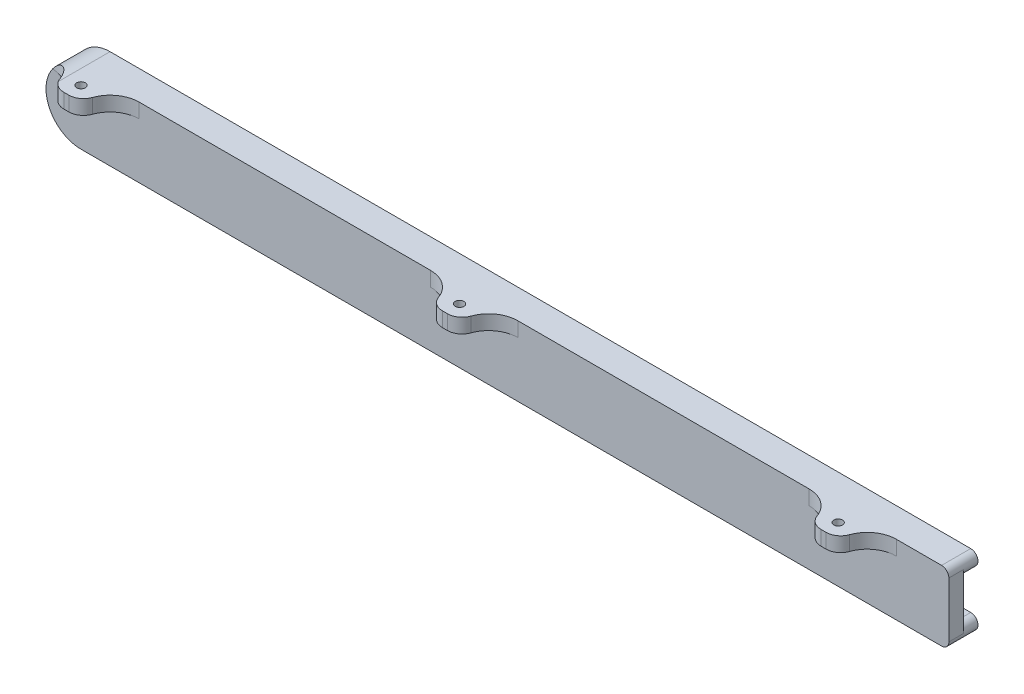
ISO-10303-21;
HEADER;
FILE_DESCRIPTION(('STEP AP214'),'2;1');
FILE_NAME('part.step','',(''),(''),'','','');
FILE_SCHEMA(('AUTOMOTIVE_DESIGN { 1 0 10303 214 1 1 1 1 }'));
ENDSEC;
DATA;
#1=APPLICATION_CONTEXT('core data for automotive mechanical design processes');
#2=APPLICATION_PROTOCOL_DEFINITION('international standard','automotive_design',2000,#1);
#3=PRODUCT_CONTEXT('',#1,'mechanical');
#4=PRODUCT('Part','Part','',(#3));
#5=PRODUCT_RELATED_PRODUCT_CATEGORY('part','',(#4));
#6=PRODUCT_DEFINITION_FORMATION('','',#4);
#7=PRODUCT_DEFINITION_CONTEXT('part definition',#1,'design');
#8=PRODUCT_DEFINITION('design','',#6,#7);
#9=PRODUCT_DEFINITION_SHAPE('','',#8);
#10=(LENGTH_UNIT() NAMED_UNIT(*) SI_UNIT(.MILLI.,.METRE.));
#11=(NAMED_UNIT(*) PLANE_ANGLE_UNIT() SI_UNIT($,.RADIAN.));
#12=(NAMED_UNIT(*) SI_UNIT($,.STERADIAN.) SOLID_ANGLE_UNIT());
#13=UNCERTAINTY_MEASURE_WITH_UNIT(LENGTH_MEASURE(1.E-05),#10,'distance_accuracy_value','');
#14=(GEOMETRIC_REPRESENTATION_CONTEXT(3) GLOBAL_UNCERTAINTY_ASSIGNED_CONTEXT((#13)) GLOBAL_UNIT_ASSIGNED_CONTEXT((#10,
#11,#12)) REPRESENTATION_CONTEXT('',''));
#15=CARTESIAN_POINT('',(0.,0.,0.));
#16=DIRECTION('',(0.,0.,1.));
#17=DIRECTION('',(1.,0.,0.));
#18=AXIS2_PLACEMENT_3D('',#15,#16,#17);
#19=CARTESIAN_POINT('',(152.5,9.5,10.));
#20=DIRECTION('',(0.,0.,-1.));
#21=DIRECTION('',(-1.,0.,0.));
#22=AXIS2_PLACEMENT_3D('',#19,#20,#21);
#23=CYLINDRICAL_SURFACE('',#22,2.5);
#24=CARTESIAN_POINT('',(152.5,9.5,5.));
#25=DIRECTION('',(0.,0.,-1.));
#26=DIRECTION('',(0.,1.,0.));
#27=AXIS2_PLACEMENT_3D('',#24,#25,#26);
#28=CIRCLE('',#27,2.5);
#29=CARTESIAN_POINT('',(152.5,7.,5.));
#30=VERTEX_POINT('',#29);
#31=CARTESIAN_POINT('',(155.,9.5,5.));
#32=VERTEX_POINT('',#31);
#33=EDGE_CURVE('E347',#30,#32,#28,.F.);
#34=ORIENTED_EDGE('',*,*,#33,.F.);
#35=DIRECTION('',(0.,0.,1.));
#36=VECTOR('',#35,1.);
#37=CARTESIAN_POINT('',(152.5,7.,10.));
#38=LINE('',#37,#36);
#39=CARTESIAN_POINT('',(152.5,7.,0.));
#40=VERTEX_POINT('',#39);
#41=EDGE_CURVE('E232',#40,#30,#38,.T.);
#42=ORIENTED_EDGE('',*,*,#41,.F.);
#43=CARTESIAN_POINT('',(152.5,9.5,0.));
#44=DIRECTION('',(0.,0.,1.));
#45=DIRECTION('',(1.,0.,0.));
#46=AXIS2_PLACEMENT_3D('',#43,#44,#45);
#47=CIRCLE('',#46,2.5);
#48=CARTESIAN_POINT('',(152.5,12.,0.));
#49=VERTEX_POINT('',#48);
#50=EDGE_CURVE('E351',#49,#40,#47,.F.);
#51=ORIENTED_EDGE('',*,*,#50,.F.);
#52=DIRECTION('',(0.,0.,-1.));
#53=VECTOR('',#52,1.);
#54=CARTESIAN_POINT('',(152.5,12.,10.));
#55=LINE('',#54,#53);
#56=CARTESIAN_POINT('',(152.5,12.,10.));
#57=VERTEX_POINT('',#56);
#58=EDGE_CURVE('E484',#57,#49,#55,.T.);
#59=ORIENTED_EDGE('',*,*,#58,.F.);
#60=CARTESIAN_POINT('',(152.5,9.5,10.));
#61=DIRECTION('',(0.,0.,1.));
#62=DIRECTION('',(1.,0.,0.));
#63=AXIS2_PLACEMENT_3D('',#60,#61,#62);
#64=CIRCLE('',#63,2.5);
#65=CARTESIAN_POINT('',(155.,9.5,10.));
#66=VERTEX_POINT('',#65);
#67=EDGE_CURVE('E355',#66,#57,#64,.T.);
#68=ORIENTED_EDGE('',*,*,#67,.F.);
#69=DIRECTION('',(0.,0.,-1.));
#70=VECTOR('',#69,1.);
#71=CARTESIAN_POINT('',(155.,9.5,10.));
#72=LINE('',#71,#70);
#73=EDGE_CURVE('E349',#32,#66,#72,.F.);
#74=ORIENTED_EDGE('',*,*,#73,.F.);
#75=EDGE_LOOP('',(#34,#42,#51,#59,#68,#74));
#76=FACE_BOUND('',#75,.T.);
#77=ADVANCED_FACE('F39',(#76),#23,.T.);
#78=CARTESIAN_POINT('',(152.5,-9.5,5.));
#79=DIRECTION('',(0.,0.,-1.));
#80=DIRECTION('',(-1.,0.,0.));
#81=AXIS2_PLACEMENT_3D('',#78,#79,#80);
#82=CYLINDRICAL_SURFACE('',#81,2.5);
#83=CARTESIAN_POINT('',(152.5,-9.5,5.));
#84=DIRECTION('',(0.,0.,-1.));
#85=DIRECTION('',(0.,1.,0.));
#86=AXIS2_PLACEMENT_3D('',#83,#84,#85);
#87=CIRCLE('',#86,2.5);
#88=CARTESIAN_POINT('',(155.,-9.5,5.));
#89=VERTEX_POINT('',#88);
#90=CARTESIAN_POINT('',(152.5,-7.,5.));
#91=VERTEX_POINT('',#90);
#92=EDGE_CURVE('E482',#89,#91,#87,.F.);
#93=ORIENTED_EDGE('',*,*,#92,.F.);
#94=DIRECTION('',(0.,0.,-1.));
#95=VECTOR('',#94,1.);
#96=CARTESIAN_POINT('',(155.,-9.5,10.));
#97=LINE('',#96,#95);
#98=CARTESIAN_POINT('',(155.,-9.5,10.));
#99=VERTEX_POINT('',#98);
#100=EDGE_CURVE('E472',#99,#89,#97,.T.);
#101=ORIENTED_EDGE('',*,*,#100,.F.);
#102=CARTESIAN_POINT('',(152.5,-9.5,10.));
#103=DIRECTION('',(0.,0.,1.));
#104=DIRECTION('',(1.,0.,0.));
#105=AXIS2_PLACEMENT_3D('',#102,#103,#104);
#106=CIRCLE('',#105,2.5);
#107=CARTESIAN_POINT('',(152.5,-12.,10.));
#108=VERTEX_POINT('',#107);
#109=EDGE_CURVE('E469',#108,#99,#106,.T.);
#110=ORIENTED_EDGE('',*,*,#109,.F.);
#111=DIRECTION('',(0.,0.,1.));
#112=VECTOR('',#111,1.);
#113=CARTESIAN_POINT('',(152.5,-12.,5.));
#114=LINE('',#113,#112);
#115=CARTESIAN_POINT('',(152.5,-12.,0.));
#116=VERTEX_POINT('',#115);
#117=EDGE_CURVE('E478',#116,#108,#114,.T.);
#118=ORIENTED_EDGE('',*,*,#117,.F.);
#119=CARTESIAN_POINT('',(152.5,-9.5,0.));
#120=DIRECTION('',(0.,0.,1.));
#121=DIRECTION('',(1.,0.,0.));
#122=AXIS2_PLACEMENT_3D('',#119,#120,#121);
#123=CIRCLE('',#122,2.5);
#124=CARTESIAN_POINT('',(152.5,-7.,0.));
#125=VERTEX_POINT('',#124);
#126=EDGE_CURVE('E480',#125,#116,#123,.F.);
#127=ORIENTED_EDGE('',*,*,#126,.F.);
#128=DIRECTION('',(0.,0.,-1.));
#129=VECTOR('',#128,1.);
#130=CARTESIAN_POINT('',(152.5,-7.,10.));
#131=LINE('',#130,#129);
#132=EDGE_CURVE('E475',#91,#125,#131,.T.);
#133=ORIENTED_EDGE('',*,*,#132,.F.);
#134=EDGE_LOOP('',(#93,#101,#110,#118,#127,#133));
#135=FACE_BOUND('',#134,.T.);
#136=ADVANCED_FACE('F295',(#135),#82,.T.);
#137=CARTESIAN_POINT('',(-143.,0.,0.));
#138=DIRECTION('',(0.,0.,-1.));
#139=DIRECTION('',(-1.,0.,0.));
#140=AXIS2_PLACEMENT_3D('',#137,#138,#139);
#141=CYLINDRICAL_SURFACE('',#140,12.);
#142=CARTESIAN_POINT('',(-152.746794344809,7.,10.0032061691671));
#143=CARTESIAN_POINT('',(-152.59088643431,7.21715144322374,10.007162286974));
#144=CARTESIAN_POINT('',(-152.427652299445,7.42906176732178,10.0149402299955));
#145=CARTESIAN_POINT('',(-152.087588612802,7.84136237842886,10.0402486514902));
#146=CARTESIAN_POINT('',(-151.910747167445,8.04174231363343,10.0577877471679));
#147=CARTESIAN_POINT('',(-151.543502423281,8.43093735462158,10.1048949897969));
#148=CARTESIAN_POINT('',(-151.35301148729,8.61965990628536,10.1345479388949));
#149=CARTESIAN_POINT('',(-150.961360686064,8.98264848251335,10.2079815328018));
#150=CARTESIAN_POINT('',(-150.760204312949,9.15691919161987,10.2517575769522));
#151=CARTESIAN_POINT('',(-150.347961353722,9.4909582470029,10.3557191601019));
#152=CARTESIAN_POINT('',(-150.136819245277,9.65062616557818,10.4160083760234));
#153=CARTESIAN_POINT('',(-149.708390380025,9.95320433838893,10.5545787208766));
#154=CARTESIAN_POINT('',(-149.491102101591,10.0961103969643,10.6328643400339));
#155=CARTESIAN_POINT('',(-149.054707335583,10.3636713068284,10.808174355743));
#156=CARTESIAN_POINT('',(-148.835617405448,10.488422154687,10.9050933939226));
#157=CARTESIAN_POINT('',(-148.397857446579,10.7202799001784,11.1185878235088));
#158=CARTESIAN_POINT('',(-148.179187221554,10.8274009849618,11.2351472553531));
#159=CARTESIAN_POINT('',(-147.886948523327,10.960138520423,11.4055618212041));
#160=CARTESIAN_POINT('',(-147.811680195578,10.9933796180717,11.4507828598084));
#161=CARTESIAN_POINT('',(-147.661704472828,11.0578104393287,11.5436189539204));
#162=CARTESIAN_POINT('',(-147.586997270198,11.0889994855398,11.591234790907));
#163=CARTESIAN_POINT('',(-147.312574794142,11.2003696222948,11.7713662412897));
#164=CARTESIAN_POINT('',(-147.115068333626,11.27422344244,11.9113065210409));
#165=CARTESIAN_POINT('',(-146.727811444008,11.408131745885,12.2077480417061));
#166=CARTESIAN_POINT('',(-146.53806651804,11.4681765730385,12.3642607601329));
#167=CARTESIAN_POINT('',(-146.168289268594,11.5757986110693,12.6932152281467));
#168=CARTESIAN_POINT('',(-145.988281412873,11.6233454762722,12.8656943981459));
#169=CARTESIAN_POINT('',(-145.640503282657,11.7072520910438,13.2250219872981));
#170=CARTESIAN_POINT('',(-145.472731056725,11.7436136275288,13.4118681052861));
#171=CARTESIAN_POINT('',(-145.151894065285,11.8066059711564,13.7975944126731));
#172=CARTESIAN_POINT('',(-144.99875590085,11.8332874469564,13.9964053972084));
#173=CARTESIAN_POINT('',(-144.707497724281,11.8788125036929,14.4055848997373));
#174=CARTESIAN_POINT('',(-144.569378357928,11.8976557476991,14.6159539141187));
#175=CARTESIAN_POINT('',(-144.30921566589,11.9290875557153,15.0468580059748));
#176=CARTESIAN_POINT('',(-144.187173222307,11.9416757766322,15.267393640372));
#177=CARTESIAN_POINT('',(-143.960018830164,11.9620805451373,15.7172168290193));
#178=CARTESIAN_POINT('',(-143.85490680313,11.9698971148429,15.9465043426978));
#179=CARTESIAN_POINT('',(-143.656448305867,11.9824689728949,16.4265537712285));
#180=CARTESIAN_POINT('',(-143.564199232512,11.9870103049376,16.6777754212751));
#181=CARTESIAN_POINT('',(-143.400111969842,11.9936090345774,17.1868719399777));
#182=CARTESIAN_POINT('',(-143.32827725359,11.995666009708,17.4447479325964));
#183=CARTESIAN_POINT('',(-143.205596471796,11.9983953149284,17.9650529455964));
#184=CARTESIAN_POINT('',(-143.154720565253,11.9990696191378,18.2274749344035));
#185=CARTESIAN_POINT('',(-143.074158033797,11.9998389931267,18.7554472421086));
#186=CARTESIAN_POINT('',(-143.044460420083,11.9999343634915,19.0209958658697));
#187=CARTESIAN_POINT('',(-143.016952592032,11.9999902899731,19.4059172745359));
#188=CARTESIAN_POINT('',(-143.010591700244,11.9999962701316,19.5247314940113));
#189=CARTESIAN_POINT('',(-143.002118313292,12.000000365937,19.7623596519448));
#190=CARTESIAN_POINT('',(-143.000000411803,11.9999984916013,19.8811733976167));
#191=CARTESIAN_POINT('',(-143.,12.,20.));
#192=B_SPLINE_CURVE_WITH_KNOTS('',3,(#142,#143,#144,#145,#146,#147,#148,#149,#150,#151,#152,
#153,#154,#155,#156,#157,#158,#159,#160,#161,#162,#163,#164,#165,#166,#167,#168,#169,#170,#171,
#172,#173,#174,#175,#176,#177,#178,#179,#180,#181,#182,#183,#184,#185,#186,#187,#188,#189,#190,
#191),.UNSPECIFIED.,.F.,.F.,(4,2,2,2,2,2,2,2,2,2,2,2,2,2,2,2,2,2,2,2,2,2,2,2,4),(0.,
0.801991741111391,1.60469261101634,2.41311173919697,3.2212677868517,4.03461894103066,
4.84817325256458,5.65725604732619,6.46568453336924,6.74731279624802,7.02903356498908,
7.78708595852273,8.5456668307013,9.30607290792291,10.0663574430185,10.8226029358483,
11.5788809329169,12.33520040786,13.0915163771003,13.8936155418934,14.6958510850026,
15.4969404300169,16.297613810034,16.6545040861717,17.0109393305914),.UNSPECIFIED.);
#193=CARTESIAN_POINT('',(-152.746794344809,7.,10.0032061691671));
#194=VERTEX_POINT('',#193);
#195=CARTESIAN_POINT('',(-143.571909584179,11.9863638951737,16.6666666666667));
#196=VERTEX_POINT('',#195);
#197=EDGE_CURVE('E272',#194,#196,#192,.T.);
#198=ORIENTED_EDGE('',*,*,#197,.T.);
#199=CARTESIAN_POINT('',(-143.571909584179,11.9863638951737,16.6666666666667));
#200=CARTESIAN_POINT('',(-143.536473783487,11.9880509254386,16.7669075712506));
#201=CARTESIAN_POINT('',(-143.497832474712,11.9897408905976,16.8660148093085));
#202=CARTESIAN_POINT('',(-143.414482502176,11.992912866526,17.0611727457929));
#203=CARTESIAN_POINT('',(-143.369799051769,11.9943956919966,17.1572341999831));
#204=CARTESIAN_POINT('',(-143.274418242039,11.9969565849873,17.3463302070627));
#205=CARTESIAN_POINT('',(-143.2237208589,11.9980346509044,17.4393647479628));
#206=CARTESIAN_POINT('',(-143.116304453324,11.999556535102,17.6224046196185));
#207=CARTESIAN_POINT('',(-143.059561775481,11.9999977556118,17.7123960890673));
#208=CARTESIAN_POINT('',(-143.,12.,17.8004843285794));
#209=B_SPLINE_CURVE_WITH_KNOTS('',3,(#199,#200,#201,#202,#203,#204,#205,#206,#207,#208),
.UNSPECIFIED.,.F.,.F.,(4,2,2,2,4),(0.,0.318945389003396,0.63659871169967,0.954253292453111,
1.27319999860349),.UNSPECIFIED.);
#210=CARTESIAN_POINT('',(-143.,12.,17.8004843285794));
#211=VERTEX_POINT('',#210);
#212=EDGE_CURVE('E300',#196,#211,#209,.T.);
#213=ORIENTED_EDGE('',*,*,#212,.T.);
#214=DIRECTION('',(0.,0.,1.));
#215=VECTOR('',#214,1.);
#216=CARTESIAN_POINT('',(-143.,12.,0.));
#217=LINE('',#216,#215);
#218=CARTESIAN_POINT('',(-143.,12.,0.));
#219=VERTEX_POINT('',#218);
#220=EDGE_CURVE('E252',#219,#211,#217,.T.);
#221=ORIENTED_EDGE('',*,*,#220,.F.);
#222=CARTESIAN_POINT('',(-143.,0.,0.));
#223=DIRECTION('',(0.,0.,1.));
#224=DIRECTION('',(1.,0.,0.));
#225=AXIS2_PLACEMENT_3D('',#222,#223,#224);
#226=CIRCLE('',#225,12.);
#227=CARTESIAN_POINT('',(-143.,-12.,0.));
#228=VERTEX_POINT('',#227);
#229=EDGE_CURVE('E266',#228,#219,#226,.F.);
#230=ORIENTED_EDGE('',*,*,#229,.F.);
#231=DIRECTION('',(0.,0.,-1.));
#232=VECTOR('',#231,1.);
#233=CARTESIAN_POINT('',(-143.,-12.,10.));
#234=LINE('',#233,#232);
#235=CARTESIAN_POINT('',(-143.,-12.,10.));
#236=VERTEX_POINT('',#235);
#237=EDGE_CURVE('E263',#236,#228,#234,.T.);
#238=ORIENTED_EDGE('',*,*,#237,.F.);
#239=CARTESIAN_POINT('',(-143.,0.,10.));
#240=DIRECTION('',(0.,0.,1.));
#241=DIRECTION('',(1.,0.,0.));
#242=AXIS2_PLACEMENT_3D('',#239,#240,#241);
#243=CIRCLE('',#242,12.);
#244=CARTESIAN_POINT('',(-152.746794344809,7.,10.));
#245=VERTEX_POINT('',#244);
#246=EDGE_CURVE('E268',#245,#236,#243,.T.);
#247=ORIENTED_EDGE('',*,*,#246,.F.);
#248=DIRECTION('',(0.,0.,-1.));
#249=VECTOR('',#248,1.);
#250=CARTESIAN_POINT('',(-152.746794344809,7.,10.));
#251=LINE('',#250,#249);
#252=EDGE_CURVE('E281',#245,#194,#251,.F.);
#253=ORIENTED_EDGE('',*,*,#252,.T.);
#254=EDGE_LOOP('',(#198,#213,#221,#230,#238,#247,#253));
#255=FACE_BOUND('',#254,.T.);
#256=ADVANCED_FACE('F287',(#255),#141,.T.);
#257=CARTESIAN_POINT('',(0.,-7.,10.));
#258=DIRECTION('',(0.,1.,0.));
#259=DIRECTION('',(0.,0.,1.));
#260=AXIS2_PLACEMENT_3D('',#257,#258,#259);
#261=PLANE('',#260);
#262=DIRECTION('',(-1.,0.,0.));
#263=VECTOR('',#262,1.);
#264=CARTESIAN_POINT('',(0.,-7.,5.));
#265=LINE('',#264,#263);
#266=CARTESIAN_POINT('',(-150.,-7.,5.));
#267=VERTEX_POINT('',#266);
#268=EDGE_CURVE('E241',#91,#267,#265,.T.);
#269=ORIENTED_EDGE('',*,*,#268,.F.);
#270=ORIENTED_EDGE('',*,*,#132,.T.);
#271=DIRECTION('',(1.,0.,0.));
#272=VECTOR('',#271,1.);
#273=CARTESIAN_POINT('',(0.,-7.,0.));
#274=LINE('',#273,#272);
#275=CARTESIAN_POINT('',(-150.,-7.,0.));
#276=VERTEX_POINT('',#275);
#277=EDGE_CURVE('E567',#276,#125,#274,.T.);
#278=ORIENTED_EDGE('',*,*,#277,.F.);
#279=DIRECTION('',(0.,0.,-1.));
#280=VECTOR('',#279,1.);
#281=CARTESIAN_POINT('',(-150.,-7.,10.));
#282=LINE('',#281,#280);
#283=EDGE_CURVE('E249',#267,#276,#282,.T.);
#284=ORIENTED_EDGE('',*,*,#283,.F.);
#285=EDGE_LOOP('',(#269,#270,#278,#284));
#286=FACE_BOUND('',#285,.T.);
#287=ADVANCED_FACE('F294',(#286),#261,.T.);
#288=CARTESIAN_POINT('',(-150.,0.,10.));
#289=DIRECTION('',(1.,0.,0.));
#290=DIRECTION('',(0.,0.,-1.));
#291=AXIS2_PLACEMENT_3D('',#288,#289,#290);
#292=PLANE('',#291);
#293=DIRECTION('',(0.,1.,0.));
#294=VECTOR('',#293,1.);
#295=CARTESIAN_POINT('',(-150.,0.,5.));
#296=LINE('',#295,#294);
#297=CARTESIAN_POINT('',(-150.,7.,5.));
#298=VERTEX_POINT('',#297);
#299=EDGE_CURVE('E235',#267,#298,#296,.T.);
#300=ORIENTED_EDGE('',*,*,#299,.F.);
#301=ORIENTED_EDGE('',*,*,#283,.T.);
#302=DIRECTION('',(0.,-1.,0.));
#303=VECTOR('',#302,1.);
#304=CARTESIAN_POINT('',(-150.,0.,0.));
#305=LINE('',#304,#303);
#306=CARTESIAN_POINT('',(-150.,7.,0.));
#307=VERTEX_POINT('',#306);
#308=EDGE_CURVE('E248',#307,#276,#305,.T.);
#309=ORIENTED_EDGE('',*,*,#308,.F.);
#310=DIRECTION('',(0.,0.,-1.));
#311=VECTOR('',#310,1.);
#312=CARTESIAN_POINT('',(-150.,7.,10.));
#313=LINE('',#312,#311);
#314=EDGE_CURVE('E229',#298,#307,#313,.T.);
#315=ORIENTED_EDGE('',*,*,#314,.F.);
#316=EDGE_LOOP('',(#300,#301,#309,#315));
#317=FACE_BOUND('',#316,.T.);
#318=ADVANCED_FACE('F246',(#317),#292,.T.);
#319=CARTESIAN_POINT('',(0.,7.,10.));
#320=DIRECTION('',(0.,1.,0.));
#321=DIRECTION('',(0.,0.,1.));
#322=AXIS2_PLACEMENT_3D('',#319,#320,#321);
#323=PLANE('',#322);
#324=DIRECTION('',(1.,0.,0.));
#325=VECTOR('',#324,1.);
#326=CARTESIAN_POINT('',(0.,7.,0.));
#327=LINE('',#326,#325);
#328=EDGE_CURVE('E572',#307,#40,#327,.T.);
#329=ORIENTED_EDGE('',*,*,#328,.T.);
#330=ORIENTED_EDGE('',*,*,#41,.T.);
#331=DIRECTION('',(-1.,0.,0.));
#332=VECTOR('',#331,1.);
#333=CARTESIAN_POINT('',(0.,7.,5.));
#334=LINE('',#333,#332);
#335=EDGE_CURVE('E224',#30,#298,#334,.T.);
#336=ORIENTED_EDGE('',*,*,#335,.T.);
#337=ORIENTED_EDGE('',*,*,#314,.T.);
#338=EDGE_LOOP('',(#329,#330,#336,#337));
#339=FACE_BOUND('',#338,.T.);
#340=ADVANCED_FACE('F227',(#339),#323,.F.);
#341=CARTESIAN_POINT('',(155.,0.,10.));
#342=DIRECTION('',(1.,0.,0.));
#343=DIRECTION('',(0.,0.,-1.));
#344=AXIS2_PLACEMENT_3D('',#341,#342,#343);
#345=PLANE('',#344);
#346=DIRECTION('',(0.,1.,0.));
#347=VECTOR('',#346,1.);
#348=CARTESIAN_POINT('',(155.,12.,5.));
#349=LINE('',#348,#347);
#350=EDGE_CURVE('E236',#89,#32,#349,.T.);
#351=ORIENTED_EDGE('',*,*,#350,.T.);
#352=ORIENTED_EDGE('',*,*,#73,.T.);
#353=DIRECTION('',(0.,-1.,0.));
#354=VECTOR('',#353,1.);
#355=CARTESIAN_POINT('',(155.,0.,10.));
#356=LINE('',#355,#354);
#357=EDGE_CURVE('E497',#66,#99,#356,.T.);
#358=ORIENTED_EDGE('',*,*,#357,.T.);
#359=ORIENTED_EDGE('',*,*,#100,.T.);
#360=EDGE_LOOP('',(#351,#352,#358,#359));
#361=FACE_BOUND('',#360,.T.);
#362=ADVANCED_FACE('F616',(#361),#345,.T.);
#363=CARTESIAN_POINT('',(0.,12.,10.));
#364=DIRECTION('',(0.,1.,0.));
#365=DIRECTION('',(0.,0.,1.));
#366=AXIS2_PLACEMENT_3D('',#363,#364,#365);
#367=PLANE('',#366);
#368=ORIENTED_EDGE('',*,*,#220,.T.);
#369=CARTESIAN_POINT('',(-138.857864376269,12.,15.));
#370=DIRECTION('',(0.,1.,0.));
#371=DIRECTION('',(0.,0.,1.));
#372=AXIS2_PLACEMENT_3D('',#369,#370,#371);
#373=CIRCLE('',#372,5.);
#374=CARTESIAN_POINT('',(-138.857864376269,12.,20.));
#375=VERTEX_POINT('',#374);
#376=EDGE_CURVE('E376',#211,#375,#373,.T.);
#377=ORIENTED_EDGE('',*,*,#376,.T.);
#378=DIRECTION('',(-1.,0.,0.));
#379=VECTOR('',#378,1.);
#380=CARTESIAN_POINT('',(-133.,12.,20.));
#381=LINE('',#380,#379);
#382=CARTESIAN_POINT('',(-137.142135623731,12.,20.));
#383=VERTEX_POINT('',#382);
#384=EDGE_CURVE('E561',#383,#375,#381,.T.);
#385=ORIENTED_EDGE('',*,*,#384,.F.);
#386=CARTESIAN_POINT('',(-137.142135623731,12.,15.));
#387=DIRECTION('',(0.,1.,0.));
#388=DIRECTION('',(0.,0.,1.));
#389=AXIS2_PLACEMENT_3D('',#386,#387,#388);
#390=CIRCLE('',#389,5.);
#391=CARTESIAN_POINT('',(-132.428090415821,12.,16.6666666666667));
#392=VERTEX_POINT('',#391);
#393=EDGE_CURVE('E381',#383,#392,#390,.T.);
#394=ORIENTED_EDGE('',*,*,#393,.T.);
#395=CARTESIAN_POINT('',(-123.,12.,20.));
#396=DIRECTION('',(0.,1.,0.));
#397=DIRECTION('',(0.,0.,1.));
#398=AXIS2_PLACEMENT_3D('',#395,#396,#397);
#399=CIRCLE('',#398,10.);
#400=CARTESIAN_POINT('',(-123.,12.,10.));
#401=VERTEX_POINT('',#400);
#402=EDGE_CURVE('E467',#392,#401,#399,.F.);
#403=ORIENTED_EDGE('',*,*,#402,.T.);
#404=DIRECTION('',(1.,0.,0.));
#405=VECTOR('',#404,1.);
#406=CARTESIAN_POINT('',(0.,12.,10.));
#407=LINE('',#406,#405);
#408=CARTESIAN_POINT('',(-23.,12.,10.));
#409=VERTEX_POINT('',#408);
#410=EDGE_CURVE('E255',#401,#409,#407,.T.);
#411=ORIENTED_EDGE('',*,*,#410,.T.);
#412=CARTESIAN_POINT('',(-23.,12.,20.));
#413=DIRECTION('',(0.,1.,0.));
#414=DIRECTION('',(0.,0.,1.));
#415=AXIS2_PLACEMENT_3D('',#412,#413,#414);
#416=CIRCLE('',#415,10.);
#417=CARTESIAN_POINT('',(-13.5719095841793,12.,16.6666666666667));
#418=VERTEX_POINT('',#417);
#419=EDGE_CURVE('E438',#409,#418,#416,.F.);
#420=ORIENTED_EDGE('',*,*,#419,.T.);
#421=CARTESIAN_POINT('',(-8.85786437626901,12.,15.));
#422=DIRECTION('',(0.,1.,0.));
#423=DIRECTION('',(0.,0.,1.));
#424=AXIS2_PLACEMENT_3D('',#421,#422,#423);
#425=CIRCLE('',#424,5.);
#426=CARTESIAN_POINT('',(-8.85786437626901,12.,20.));
#427=VERTEX_POINT('',#426);
#428=EDGE_CURVE('E386',#418,#427,#425,.T.);
#429=ORIENTED_EDGE('',*,*,#428,.T.);
#430=DIRECTION('',(-1.,0.,0.));
#431=VECTOR('',#430,1.);
#432=CARTESIAN_POINT('',(-2.99999999999995,12.,20.));
#433=LINE('',#432,#431);
#434=CARTESIAN_POINT('',(-7.1421356237309,12.,20.));
#435=VERTEX_POINT('',#434);
#436=EDGE_CURVE('E434',#435,#427,#433,.T.);
#437=ORIENTED_EDGE('',*,*,#436,.F.);
#438=CARTESIAN_POINT('',(-7.1421356237309,12.,15.));
#439=DIRECTION('',(0.,1.,0.));
#440=DIRECTION('',(0.,0.,1.));
#441=AXIS2_PLACEMENT_3D('',#438,#439,#440);
#442=CIRCLE('',#441,5.);
#443=CARTESIAN_POINT('',(-2.42809041582058,12.,16.6666666666667));
#444=VERTEX_POINT('',#443);
#445=EDGE_CURVE('E428',#435,#444,#442,.T.);
#446=ORIENTED_EDGE('',*,*,#445,.T.);
#447=CARTESIAN_POINT('',(7.00000000000005,12.,20.));
#448=DIRECTION('',(0.,1.,0.));
#449=DIRECTION('',(0.,0.,1.));
#450=AXIS2_PLACEMENT_3D('',#447,#448,#449);
#451=CIRCLE('',#450,10.);
#452=CARTESIAN_POINT('',(7.00000000000005,12.,10.));
#453=VERTEX_POINT('',#452);
#454=EDGE_CURVE('E458',#444,#453,#451,.F.);
#455=ORIENTED_EDGE('',*,*,#454,.T.);
#456=CARTESIAN_POINT('',(107.,12.,10.));
#457=VERTEX_POINT('',#456);
#458=EDGE_CURVE('E424',#453,#457,#407,.T.);
#459=ORIENTED_EDGE('',*,*,#458,.T.);
#460=CARTESIAN_POINT('',(107.,12.,20.));
#461=DIRECTION('',(0.,1.,0.));
#462=DIRECTION('',(0.,0.,1.));
#463=AXIS2_PLACEMENT_3D('',#460,#461,#462);
#464=CIRCLE('',#463,10.);
#465=CARTESIAN_POINT('',(116.428090415821,12.,16.6666666666667));
#466=VERTEX_POINT('',#465);
#467=EDGE_CURVE('E415',#457,#466,#464,.F.);
#468=ORIENTED_EDGE('',*,*,#467,.T.);
#469=CARTESIAN_POINT('',(121.142135623731,12.,15.));
#470=DIRECTION('',(0.,1.,0.));
#471=DIRECTION('',(0.,0.,1.));
#472=AXIS2_PLACEMENT_3D('',#469,#470,#471);
#473=CIRCLE('',#472,5.);
#474=CARTESIAN_POINT('',(121.142135623731,12.,20.));
#475=VERTEX_POINT('',#474);
#476=EDGE_CURVE('E421',#466,#475,#473,.T.);
#477=ORIENTED_EDGE('',*,*,#476,.T.);
#478=DIRECTION('',(-1.,0.,0.));
#479=VECTOR('',#478,1.);
#480=CARTESIAN_POINT('',(127.,12.,20.));
#481=LINE('',#480,#479);
#482=CARTESIAN_POINT('',(122.857864376269,12.,20.));
#483=VERTEX_POINT('',#482);
#484=EDGE_CURVE('E539',#483,#475,#481,.T.);
#485=ORIENTED_EDGE('',*,*,#484,.F.);
#486=CARTESIAN_POINT('',(122.857864376269,12.,15.));
#487=DIRECTION('',(0.,1.,0.));
#488=DIRECTION('',(0.,0.,1.));
#489=AXIS2_PLACEMENT_3D('',#486,#487,#488);
#490=CIRCLE('',#489,5.);
#491=CARTESIAN_POINT('',(127.571909584179,12.,16.6666666666667));
#492=VERTEX_POINT('',#491);
#493=EDGE_CURVE('E308',#483,#492,#490,.T.);
#494=ORIENTED_EDGE('',*,*,#493,.T.);
#495=CARTESIAN_POINT('',(137.,12.,20.));
#496=DIRECTION('',(0.,1.,0.));
#497=DIRECTION('',(0.,0.,1.));
#498=AXIS2_PLACEMENT_3D('',#495,#496,#497);
#499=CIRCLE('',#498,10.);
#500=CARTESIAN_POINT('',(137.,12.,10.));
#501=VERTEX_POINT('',#500);
#502=EDGE_CURVE('E501',#492,#501,#499,.F.);
#503=ORIENTED_EDGE('',*,*,#502,.T.);
#504=EDGE_CURVE('E495',#501,#57,#407,.T.);
#505=ORIENTED_EDGE('',*,*,#504,.T.);
#506=ORIENTED_EDGE('',*,*,#58,.T.);
#507=DIRECTION('',(1.,0.,0.));
#508=VECTOR('',#507,1.);
#509=CARTESIAN_POINT('',(0.,12.,0.));
#510=LINE('',#509,#508);
#511=EDGE_CURVE('E575',#219,#49,#510,.T.);
#512=ORIENTED_EDGE('',*,*,#511,.F.);
#513=EDGE_LOOP('',(#368,#377,#385,#394,#403,#411,#420,#429,#437,#446,#455,#459,#468,#477,#485,
#494,#503,#505,#506,#512));
#514=FACE_BOUND('',#513,.T.);
#515=CARTESIAN_POINT('',(-138.,12.,15.));
#516=DIRECTION('',(0.,-1.,0.));
#517=DIRECTION('',(0.,0.,-1.));
#518=AXIS2_PLACEMENT_3D('',#515,#516,#517);
#519=CIRCLE('',#518,1.5);
#520=CARTESIAN_POINT('',(-138.,12.,13.5));
#521=VERTEX_POINT('',#520);
#522=EDGE_CURVE('E555',#521,#521,#519,.T.);
#523=ORIENTED_EDGE('',*,*,#522,.T.);
#524=EDGE_LOOP('',(#523));
#525=FACE_BOUND('',#524,.T.);
#526=CARTESIAN_POINT('',(-7.99999999999995,12.,15.));
#527=DIRECTION('',(0.,-1.,0.));
#528=DIRECTION('',(0.,0.,-1.));
#529=AXIS2_PLACEMENT_3D('',#526,#527,#528);
#530=CIRCLE('',#529,1.5);
#531=CARTESIAN_POINT('',(-7.99999999999995,12.,13.5));
#532=VERTEX_POINT('',#531);
#533=EDGE_CURVE('E547',#532,#532,#530,.T.);
#534=ORIENTED_EDGE('',*,*,#533,.T.);
#535=EDGE_LOOP('',(#534));
#536=FACE_BOUND('',#535,.T.);
#537=CARTESIAN_POINT('',(122.,12.,15.));
#538=DIRECTION('',(0.,-1.,0.));
#539=DIRECTION('',(0.,0.,-1.));
#540=AXIS2_PLACEMENT_3D('',#537,#538,#539);
#541=CIRCLE('',#540,1.5);
#542=CARTESIAN_POINT('',(122.,12.,13.5));
#543=VERTEX_POINT('',#542);
#544=EDGE_CURVE('E537',#543,#543,#541,.T.);
#545=ORIENTED_EDGE('',*,*,#544,.T.);
#546=EDGE_LOOP('',(#545));
#547=FACE_BOUND('',#546,.T.);
#548=ADVANCED_FACE('F418',(#514,#525,#536,#547),#367,.T.);
#549=CARTESIAN_POINT('',(0.,-12.,10.));
#550=DIRECTION('',(0.,1.,0.));
#551=DIRECTION('',(0.,0.,1.));
#552=AXIS2_PLACEMENT_3D('',#549,#550,#551);
#553=PLANE('',#552);
#554=DIRECTION('',(1.,0.,0.));
#555=VECTOR('',#554,1.);
#556=CARTESIAN_POINT('',(0.,-12.,0.));
#557=LINE('',#556,#555);
#558=EDGE_CURVE('E258',#228,#116,#557,.T.);
#559=ORIENTED_EDGE('',*,*,#558,.T.);
#560=ORIENTED_EDGE('',*,*,#117,.T.);
#561=DIRECTION('',(1.,0.,0.));
#562=VECTOR('',#561,1.);
#563=CARTESIAN_POINT('',(0.,-12.,10.));
#564=LINE('',#563,#562);
#565=EDGE_CURVE('E250',#236,#108,#564,.T.);
#566=ORIENTED_EDGE('',*,*,#565,.F.);
#567=ORIENTED_EDGE('',*,*,#237,.T.);
#568=EDGE_LOOP('',(#559,#560,#566,#567));
#569=FACE_BOUND('',#568,.T.);
#570=ADVANCED_FACE('F579',(#569),#553,.F.);
#571=CARTESIAN_POINT('',(0.,0.,10.));
#572=DIRECTION('',(0.,0.,1.));
#573=DIRECTION('',(1.,0.,0.));
#574=AXIS2_PLACEMENT_3D('',#571,#572,#573);
#575=PLANE('',#574);
#576=ORIENTED_EDGE('',*,*,#357,.F.);
#577=ORIENTED_EDGE('',*,*,#67,.T.);
#578=ORIENTED_EDGE('',*,*,#504,.F.);
#579=DIRECTION('',(0.,-1.,0.));
#580=VECTOR('',#579,1.);
#581=CARTESIAN_POINT('',(137.,7.,10.));
#582=LINE('',#581,#580);
#583=CARTESIAN_POINT('',(137.,7.,10.));
#584=VERTEX_POINT('',#583);
#585=EDGE_CURVE('E519',#501,#584,#582,.T.);
#586=ORIENTED_EDGE('',*,*,#585,.T.);
#587=DIRECTION('',(1.,0.,0.));
#588=VECTOR('',#587,1.);
#589=CARTESIAN_POINT('',(127.,7.,10.));
#590=LINE('',#589,#588);
#591=CARTESIAN_POINT('',(107.,7.,10.));
#592=VERTEX_POINT('',#591);
#593=EDGE_CURVE('E534',#592,#584,#590,.T.);
#594=ORIENTED_EDGE('',*,*,#593,.F.);
#595=DIRECTION('',(0.,-1.,0.));
#596=VECTOR('',#595,1.);
#597=CARTESIAN_POINT('',(107.,12.,10.));
#598=LINE('',#597,#596);
#599=EDGE_CURVE('E517',#592,#457,#598,.F.);
#600=ORIENTED_EDGE('',*,*,#599,.T.);
#601=ORIENTED_EDGE('',*,*,#458,.F.);
#602=DIRECTION('',(0.,-1.,0.));
#603=VECTOR('',#602,1.);
#604=CARTESIAN_POINT('',(7.00000000000005,7.,10.));
#605=LINE('',#604,#603);
#606=CARTESIAN_POINT('',(7.00000000000005,7.,10.));
#607=VERTEX_POINT('',#606);
#608=EDGE_CURVE('E512',#453,#607,#605,.T.);
#609=ORIENTED_EDGE('',*,*,#608,.T.);
#610=DIRECTION('',(1.,0.,0.));
#611=VECTOR('',#610,1.);
#612=CARTESIAN_POINT('',(-2.99999999999995,7.,10.));
#613=LINE('',#612,#611);
#614=CARTESIAN_POINT('',(-23.,7.,10.));
#615=VERTEX_POINT('',#614);
#616=EDGE_CURVE('E527',#615,#607,#613,.T.);
#617=ORIENTED_EDGE('',*,*,#616,.F.);
#618=DIRECTION('',(0.,-1.,0.));
#619=VECTOR('',#618,1.);
#620=CARTESIAN_POINT('',(-23.,12.,10.));
#621=LINE('',#620,#619);
#622=EDGE_CURVE('E457',#615,#409,#621,.F.);
#623=ORIENTED_EDGE('',*,*,#622,.T.);
#624=ORIENTED_EDGE('',*,*,#410,.F.);
#625=DIRECTION('',(0.,-1.,0.));
#626=VECTOR('',#625,1.);
#627=CARTESIAN_POINT('',(-123.,7.,10.));
#628=LINE('',#627,#626);
#629=CARTESIAN_POINT('',(-123.,7.,10.));
#630=VERTEX_POINT('',#629);
#631=EDGE_CURVE('E508',#401,#630,#628,.T.);
#632=ORIENTED_EDGE('',*,*,#631,.T.);
#633=DIRECTION('',(1.,0.,0.));
#634=VECTOR('',#633,1.);
#635=CARTESIAN_POINT('',(-133.,7.,10.));
#636=LINE('',#635,#634);
#637=EDGE_CURVE('E558',#245,#630,#636,.T.);
#638=ORIENTED_EDGE('',*,*,#637,.F.);
#639=ORIENTED_EDGE('',*,*,#246,.T.);
#640=ORIENTED_EDGE('',*,*,#565,.T.);
#641=ORIENTED_EDGE('',*,*,#109,.T.);
#642=EDGE_LOOP('',(#576,#577,#578,#586,#594,#600,#601,#609,#617,#623,#624,#632,#638,#639,#640,#641));
#643=FACE_BOUND('',#642,.T.);
#644=ADVANCED_FACE('F492',(#643),#575,.T.);
#645=CARTESIAN_POINT('',(0.,0.,0.));
#646=DIRECTION('',(0.,0.,1.));
#647=DIRECTION('',(1.,0.,0.));
#648=AXIS2_PLACEMENT_3D('',#645,#646,#647);
#649=PLANE('',#648);
#650=ORIENTED_EDGE('',*,*,#511,.T.);
#651=ORIENTED_EDGE('',*,*,#50,.T.);
#652=ORIENTED_EDGE('',*,*,#328,.F.);
#653=ORIENTED_EDGE('',*,*,#308,.T.);
#654=ORIENTED_EDGE('',*,*,#277,.T.);
#655=ORIENTED_EDGE('',*,*,#126,.T.);
#656=ORIENTED_EDGE('',*,*,#558,.F.);
#657=ORIENTED_EDGE('',*,*,#229,.T.);
#658=EDGE_LOOP('',(#650,#651,#652,#653,#654,#655,#656,#657));
#659=FACE_BOUND('',#658,.T.);
#660=ADVANCED_FACE('F584',(#659),#649,.F.);
#661=CARTESIAN_POINT('',(-155.,12.,5.));
#662=DIRECTION('',(0.,0.,-1.));
#663=DIRECTION('',(0.,1.,0.));
#664=AXIS2_PLACEMENT_3D('',#661,#662,#663);
#665=PLANE('',#664);
#666=ORIENTED_EDGE('',*,*,#350,.F.);
#667=ORIENTED_EDGE('',*,*,#92,.T.);
#668=ORIENTED_EDGE('',*,*,#268,.T.);
#669=ORIENTED_EDGE('',*,*,#299,.T.);
#670=ORIENTED_EDGE('',*,*,#335,.F.);
#671=ORIENTED_EDGE('',*,*,#33,.T.);
#672=EDGE_LOOP('',(#666,#667,#668,#669,#670,#671));
#673=FACE_BOUND('',#672,.T.);
#674=ADVANCED_FACE('F239',(#673),#665,.T.);
#675=CARTESIAN_POINT('',(-133.,12.,20.));
#676=DIRECTION('',(0.,0.,1.));
#677=DIRECTION('',(1.,0.,0.));
#678=AXIS2_PLACEMENT_3D('',#675,#676,#677);
#679=PLANE('',#678);
#680=ORIENTED_EDGE('',*,*,#384,.T.);
#681=DIRECTION('',(0.,-1.,0.));
#682=VECTOR('',#681,1.);
#683=CARTESIAN_POINT('',(-138.857864376269,7.,20.));
#684=LINE('',#683,#682);
#685=CARTESIAN_POINT('',(-138.857864376269,7.,20.));
#686=VERTEX_POINT('',#685);
#687=EDGE_CURVE('E353',#375,#686,#684,.T.);
#688=ORIENTED_EDGE('',*,*,#687,.T.);
#689=DIRECTION('',(-1.,0.,0.));
#690=VECTOR('',#689,1.);
#691=CARTESIAN_POINT('',(-133.,7.,20.));
#692=LINE('',#691,#690);
#693=CARTESIAN_POINT('',(-137.142135623731,7.,20.));
#694=VERTEX_POINT('',#693);
#695=EDGE_CURVE('E563',#694,#686,#692,.T.);
#696=ORIENTED_EDGE('',*,*,#695,.F.);
#697=DIRECTION('',(0.,-1.,0.));
#698=VECTOR('',#697,1.);
#699=CARTESIAN_POINT('',(-137.142135623731,12.,20.));
#700=LINE('',#699,#698);
#701=EDGE_CURVE('E350',#694,#383,#700,.F.);
#702=ORIENTED_EDGE('',*,*,#701,.T.);
#703=EDGE_LOOP('',(#680,#688,#696,#702));
#704=FACE_BOUND('',#703,.T.);
#705=ADVANCED_FACE('F592',(#704),#679,.T.);
#706=CARTESIAN_POINT('',(0.,7.,0.));
#707=DIRECTION('',(0.,1.,0.));
#708=DIRECTION('',(0.,0.,1.));
#709=AXIS2_PLACEMENT_3D('',#706,#707,#708);
#710=PLANE('',#709);
#711=CARTESIAN_POINT('',(-138.,7.,15.));
#712=DIRECTION('',(0.,-1.,0.));
#713=DIRECTION('',(0.,0.,-1.));
#714=AXIS2_PLACEMENT_3D('',#711,#712,#713);
#715=CIRCLE('',#714,1.5);
#716=CARTESIAN_POINT('',(-138.,7.,13.5));
#717=VERTEX_POINT('',#716);
#718=EDGE_CURVE('E446',#717,#717,#715,.T.);
#719=ORIENTED_EDGE('',*,*,#718,.F.);
#720=EDGE_LOOP('',(#719));
#721=FACE_BOUND('',#720,.T.);
#722=ORIENTED_EDGE('',*,*,#695,.T.);
#723=CARTESIAN_POINT('',(-138.857864376269,7.,15.));
#724=DIRECTION('',(0.,1.,0.));
#725=DIRECTION('',(0.,0.,1.));
#726=AXIS2_PLACEMENT_3D('',#723,#724,#725);
#727=CIRCLE('',#726,5.);
#728=CARTESIAN_POINT('',(-143.571909584179,7.,16.6666666666667));
#729=VERTEX_POINT('',#728);
#730=EDGE_CURVE('E362',#686,#729,#727,.F.);
#731=ORIENTED_EDGE('',*,*,#730,.T.);
#732=CARTESIAN_POINT('',(-153.,7.,20.));
#733=DIRECTION('',(0.,1.,0.));
#734=DIRECTION('',(0.,0.,1.));
#735=AXIS2_PLACEMENT_3D('',#732,#733,#734);
#736=CIRCLE('',#735,10.);
#737=EDGE_CURVE('E270',#729,#194,#736,.T.);
#738=ORIENTED_EDGE('',*,*,#737,.T.);
#739=ORIENTED_EDGE('',*,*,#252,.F.);
#740=ORIENTED_EDGE('',*,*,#637,.T.);
#741=CARTESIAN_POINT('',(-123.,7.,20.));
#742=DIRECTION('',(0.,1.,0.));
#743=DIRECTION('',(0.,0.,1.));
#744=AXIS2_PLACEMENT_3D('',#741,#742,#743);
#745=CIRCLE('',#744,10.);
#746=CARTESIAN_POINT('',(-132.428090415821,7.,16.6666666666667));
#747=VERTEX_POINT('',#746);
#748=EDGE_CURVE('E460',#630,#747,#745,.T.);
#749=ORIENTED_EDGE('',*,*,#748,.T.);
#750=CARTESIAN_POINT('',(-137.142135623731,7.,15.));
#751=DIRECTION('',(0.,1.,0.));
#752=DIRECTION('',(0.,0.,1.));
#753=AXIS2_PLACEMENT_3D('',#750,#751,#752);
#754=CIRCLE('',#753,5.);
#755=EDGE_CURVE('E361',#747,#694,#754,.F.);
#756=ORIENTED_EDGE('',*,*,#755,.T.);
#757=EDGE_LOOP('',(#722,#731,#738,#739,#740,#749,#756));
#758=FACE_BOUND('',#757,.T.);
#759=ADVANCED_FACE('F588',(#721,#758),#710,.F.);
#760=CARTESIAN_POINT('',(-138.,12.,15.));
#761=DIRECTION('',(0.,-1.,0.));
#762=DIRECTION('',(0.,0.,-1.));
#763=AXIS2_PLACEMENT_3D('',#760,#761,#762);
#764=CYLINDRICAL_SURFACE('',#763,1.5);
#765=ORIENTED_EDGE('',*,*,#522,.F.);
#766=EDGE_LOOP('',(#765));
#767=FACE_BOUND('',#766,.T.);
#768=ORIENTED_EDGE('',*,*,#718,.T.);
#769=EDGE_LOOP('',(#768));
#770=FACE_BOUND('',#769,.T.);
#771=ADVANCED_FACE('F591',(#767,#770),#764,.F.);
#772=CARTESIAN_POINT('',(-2.99999999999995,12.,20.));
#773=DIRECTION('',(0.,0.,1.));
#774=DIRECTION('',(1.,0.,0.));
#775=AXIS2_PLACEMENT_3D('',#772,#773,#774);
#776=PLANE('',#775);
#777=ORIENTED_EDGE('',*,*,#436,.T.);
#778=DIRECTION('',(0.,-1.,0.));
#779=VECTOR('',#778,1.);
#780=CARTESIAN_POINT('',(-8.85786437626901,7.,20.));
#781=LINE('',#780,#779);
#782=CARTESIAN_POINT('',(-8.85786437626901,7.,20.));
#783=VERTEX_POINT('',#782);
#784=EDGE_CURVE('E391',#427,#783,#781,.T.);
#785=ORIENTED_EDGE('',*,*,#784,.T.);
#786=DIRECTION('',(-1.,0.,0.));
#787=VECTOR('',#786,1.);
#788=CARTESIAN_POINT('',(-2.99999999999995,7.,20.));
#789=LINE('',#788,#787);
#790=CARTESIAN_POINT('',(-7.1421356237309,7.,20.));
#791=VERTEX_POINT('',#790);
#792=EDGE_CURVE('E447',#791,#783,#789,.T.);
#793=ORIENTED_EDGE('',*,*,#792,.F.);
#794=DIRECTION('',(0.,-1.,0.));
#795=VECTOR('',#794,1.);
#796=CARTESIAN_POINT('',(-7.1421356237309,12.,20.));
#797=LINE('',#796,#795);
#798=EDGE_CURVE('E384',#791,#435,#797,.F.);
#799=ORIENTED_EDGE('',*,*,#798,.T.);
#800=EDGE_LOOP('',(#777,#785,#793,#799));
#801=FACE_BOUND('',#800,.T.);
#802=ADVANCED_FACE('F442',(#801),#776,.T.);
#803=CARTESIAN_POINT('',(0.,7.,0.));
#804=DIRECTION('',(0.,-1.,0.));
#805=DIRECTION('',(0.,0.,-1.));
#806=AXIS2_PLACEMENT_3D('',#803,#804,#805);
#807=PLANE('',#806);
#808=CARTESIAN_POINT('',(-7.99999999999995,7.,15.));
#809=DIRECTION('',(0.,-1.,0.));
#810=DIRECTION('',(0.,0.,-1.));
#811=AXIS2_PLACEMENT_3D('',#808,#809,#810);
#812=CIRCLE('',#811,1.5);
#813=CARTESIAN_POINT('',(-7.99999999999995,7.,13.5));
#814=VERTEX_POINT('',#813);
#815=EDGE_CURVE('E550',#814,#814,#812,.T.);
#816=ORIENTED_EDGE('',*,*,#815,.F.);
#817=EDGE_LOOP('',(#816));
#818=FACE_BOUND('',#817,.T.);
#819=ORIENTED_EDGE('',*,*,#792,.T.);
#820=CARTESIAN_POINT('',(-8.85786437626901,7.,15.));
#821=DIRECTION('',(0.,-1.,0.));
#822=DIRECTION('',(0.,0.,-1.));
#823=AXIS2_PLACEMENT_3D('',#820,#821,#822);
#824=CIRCLE('',#823,5.);
#825=CARTESIAN_POINT('',(-13.5719095841793,7.,16.6666666666667));
#826=VERTEX_POINT('',#825);
#827=EDGE_CURVE('E396',#783,#826,#824,.T.);
#828=ORIENTED_EDGE('',*,*,#827,.T.);
#829=CARTESIAN_POINT('',(-23.,7.,20.));
#830=DIRECTION('',(0.,-1.,0.));
#831=DIRECTION('',(0.,0.,-1.));
#832=AXIS2_PLACEMENT_3D('',#829,#830,#831);
#833=CIRCLE('',#832,10.);
#834=EDGE_CURVE('E452',#826,#615,#833,.F.);
#835=ORIENTED_EDGE('',*,*,#834,.T.);
#836=ORIENTED_EDGE('',*,*,#616,.T.);
#837=CARTESIAN_POINT('',(7.00000000000005,7.,20.));
#838=DIRECTION('',(0.,-1.,0.));
#839=DIRECTION('',(0.,0.,-1.));
#840=AXIS2_PLACEMENT_3D('',#837,#838,#839);
#841=CIRCLE('',#840,10.);
#842=CARTESIAN_POINT('',(-2.42809041582058,7.,16.6666666666667));
#843=VERTEX_POINT('',#842);
#844=EDGE_CURVE('E425',#607,#843,#841,.F.);
#845=ORIENTED_EDGE('',*,*,#844,.T.);
#846=CARTESIAN_POINT('',(-7.1421356237309,7.,15.));
#847=DIRECTION('',(0.,-1.,0.));
#848=DIRECTION('',(0.,0.,-1.));
#849=AXIS2_PLACEMENT_3D('',#846,#847,#848);
#850=CIRCLE('',#849,5.);
#851=EDGE_CURVE('E394',#843,#791,#850,.T.);
#852=ORIENTED_EDGE('',*,*,#851,.T.);
#853=EDGE_LOOP('',(#819,#828,#835,#836,#845,#852));
#854=FACE_BOUND('',#853,.T.);
#855=ADVANCED_FACE('F451',(#818,#854),#807,.T.);
#856=CARTESIAN_POINT('',(-7.99999999999995,12.,15.));
#857=DIRECTION('',(0.,-1.,0.));
#858=DIRECTION('',(0.,0.,-1.));
#859=AXIS2_PLACEMENT_3D('',#856,#857,#858);
#860=CYLINDRICAL_SURFACE('',#859,1.5);
#861=ORIENTED_EDGE('',*,*,#533,.F.);
#862=EDGE_LOOP('',(#861));
#863=FACE_BOUND('',#862,.T.);
#864=ORIENTED_EDGE('',*,*,#815,.T.);
#865=EDGE_LOOP('',(#864));
#866=FACE_BOUND('',#865,.T.);
#867=ADVANCED_FACE('F700',(#863,#866),#860,.F.);
#868=CARTESIAN_POINT('',(127.,12.,20.));
#869=DIRECTION('',(0.,0.,1.));
#870=DIRECTION('',(1.,0.,0.));
#871=AXIS2_PLACEMENT_3D('',#868,#869,#870);
#872=PLANE('',#871);
#873=ORIENTED_EDGE('',*,*,#484,.T.);
#874=DIRECTION('',(0.,-1.,0.));
#875=VECTOR('',#874,1.);
#876=CARTESIAN_POINT('',(121.142135623731,7.,20.));
#877=LINE('',#876,#875);
#878=CARTESIAN_POINT('',(121.142135623731,7.,20.));
#879=VERTEX_POINT('',#878);
#880=EDGE_CURVE('E405',#475,#879,#877,.T.);
#881=ORIENTED_EDGE('',*,*,#880,.T.);
#882=DIRECTION('',(-1.,0.,0.));
#883=VECTOR('',#882,1.);
#884=CARTESIAN_POINT('',(127.,7.,20.));
#885=LINE('',#884,#883);
#886=CARTESIAN_POINT('',(122.857864376269,7.,20.));
#887=VERTEX_POINT('',#886);
#888=EDGE_CURVE('E536',#887,#879,#885,.T.);
#889=ORIENTED_EDGE('',*,*,#888,.F.);
#890=DIRECTION('',(0.,-1.,0.));
#891=VECTOR('',#890,1.);
#892=CARTESIAN_POINT('',(122.857864376269,12.,20.));
#893=LINE('',#892,#891);
#894=EDGE_CURVE('E403',#887,#483,#893,.F.);
#895=ORIENTED_EDGE('',*,*,#894,.T.);
#896=EDGE_LOOP('',(#873,#881,#889,#895));
#897=FACE_BOUND('',#896,.T.);
#898=ADVANCED_FACE('F708',(#897),#872,.T.);
#899=CARTESIAN_POINT('',(0.,7.,0.));
#900=DIRECTION('',(0.,-1.,0.));
#901=DIRECTION('',(0.,0.,-1.));
#902=AXIS2_PLACEMENT_3D('',#899,#900,#901);
#903=PLANE('',#902);
#904=CARTESIAN_POINT('',(122.,7.,15.));
#905=DIRECTION('',(0.,-1.,0.));
#906=DIRECTION('',(0.,0.,-1.));
#907=AXIS2_PLACEMENT_3D('',#904,#905,#906);
#908=CIRCLE('',#907,1.5);
#909=CARTESIAN_POINT('',(122.,7.,13.5));
#910=VERTEX_POINT('',#909);
#911=EDGE_CURVE('E542',#910,#910,#908,.T.);
#912=ORIENTED_EDGE('',*,*,#911,.F.);
#913=EDGE_LOOP('',(#912));
#914=FACE_BOUND('',#913,.T.);
#915=ORIENTED_EDGE('',*,*,#888,.T.);
#916=CARTESIAN_POINT('',(121.142135623731,7.,15.));
#917=DIRECTION('',(0.,-1.,0.));
#918=DIRECTION('',(0.,0.,-1.));
#919=AXIS2_PLACEMENT_3D('',#916,#917,#918);
#920=CIRCLE('',#919,5.);
#921=CARTESIAN_POINT('',(116.428090415821,7.,16.6666666666667));
#922=VERTEX_POINT('',#921);
#923=EDGE_CURVE('E54',#879,#922,#920,.T.);
#924=ORIENTED_EDGE('',*,*,#923,.T.);
#925=CARTESIAN_POINT('',(107.,7.,20.));
#926=DIRECTION('',(0.,-1.,0.));
#927=DIRECTION('',(0.,0.,-1.));
#928=AXIS2_PLACEMENT_3D('',#925,#926,#927);
#929=CIRCLE('',#928,10.);
#930=EDGE_CURVE('E416',#922,#592,#929,.F.);
#931=ORIENTED_EDGE('',*,*,#930,.T.);
#932=ORIENTED_EDGE('',*,*,#593,.T.);
#933=CARTESIAN_POINT('',(137.,7.,20.));
#934=DIRECTION('',(0.,-1.,0.));
#935=DIRECTION('',(0.,0.,-1.));
#936=AXIS2_PLACEMENT_3D('',#933,#934,#935);
#937=CIRCLE('',#936,10.);
#938=CARTESIAN_POINT('',(127.571909584179,7.,16.6666666666667));
#939=VERTEX_POINT('',#938);
#940=EDGE_CURVE('E521',#584,#939,#937,.F.);
#941=ORIENTED_EDGE('',*,*,#940,.T.);
#942=CARTESIAN_POINT('',(122.857864376269,7.,15.));
#943=DIRECTION('',(0.,-1.,0.));
#944=DIRECTION('',(0.,0.,-1.));
#945=AXIS2_PLACEMENT_3D('',#942,#943,#944);
#946=CIRCLE('',#945,5.);
#947=EDGE_CURVE('E62',#939,#887,#946,.T.);
#948=ORIENTED_EDGE('',*,*,#947,.T.);
#949=EDGE_LOOP('',(#915,#924,#931,#932,#941,#948));
#950=FACE_BOUND('',#949,.T.);
#951=ADVANCED_FACE('F713',(#914,#950),#903,.T.);
#952=CARTESIAN_POINT('',(122.,12.,15.));
#953=DIRECTION('',(0.,-1.,0.));
#954=DIRECTION('',(0.,0.,-1.));
#955=AXIS2_PLACEMENT_3D('',#952,#953,#954);
#956=CYLINDRICAL_SURFACE('',#955,1.5);
#957=ORIENTED_EDGE('',*,*,#544,.F.);
#958=EDGE_LOOP('',(#957));
#959=FACE_BOUND('',#958,.T.);
#960=ORIENTED_EDGE('',*,*,#911,.T.);
#961=EDGE_LOOP('',(#960));
#962=FACE_BOUND('',#961,.T.);
#963=ADVANCED_FACE('F723',(#959,#962),#956,.F.);
#964=CARTESIAN_POINT('',(-153.,12.,20.));
#965=DIRECTION('',(0.,1.,0.));
#966=DIRECTION('',(0.,0.,1.));
#967=AXIS2_PLACEMENT_3D('',#964,#965,#966);
#968=CYLINDRICAL_SURFACE('',#967,10.);
#969=ORIENTED_EDGE('',*,*,#737,.F.);
#970=DIRECTION('',(0.,1.,0.));
#971=VECTOR('',#970,1.);
#972=CARTESIAN_POINT('',(-143.571909584179,12.,16.6666666666667));
#973=LINE('',#972,#971);
#974=EDGE_CURVE('E309',#729,#196,#973,.T.);
#975=ORIENTED_EDGE('',*,*,#974,.T.);
#976=ORIENTED_EDGE('',*,*,#197,.F.);
#977=EDGE_LOOP('',(#969,#975,#976));
#978=FACE_BOUND('',#977,.T.);
#979=ADVANCED_FACE('F283',(#978),#968,.F.);
#980=CARTESIAN_POINT('',(137.,0.,20.));
#981=DIRECTION('',(0.,1.,0.));
#982=DIRECTION('',(0.,0.,1.));
#983=AXIS2_PLACEMENT_3D('',#980,#981,#982);
#984=CYLINDRICAL_SURFACE('',#983,10.);
#985=ORIENTED_EDGE('',*,*,#502,.F.);
#986=DIRECTION('',(0.,1.,0.));
#987=VECTOR('',#986,1.);
#988=CARTESIAN_POINT('',(127.571909584179,0.,16.6666666666667));
#989=LINE('',#988,#987);
#990=EDGE_CURVE('E11',#492,#939,#989,.F.);
#991=ORIENTED_EDGE('',*,*,#990,.T.);
#992=ORIENTED_EDGE('',*,*,#940,.F.);
#993=ORIENTED_EDGE('',*,*,#585,.F.);
#994=EDGE_LOOP('',(#985,#991,#992,#993));
#995=FACE_BOUND('',#994,.T.);
#996=ADVANCED_FACE('F735',(#995),#984,.F.);
#997=CARTESIAN_POINT('',(107.,12.,20.));
#998=DIRECTION('',(0.,1.,0.));
#999=DIRECTION('',(0.,0.,1.));
#1000=AXIS2_PLACEMENT_3D('',#997,#998,#999);
#1001=CYLINDRICAL_SURFACE('',#1000,10.);
#1002=ORIENTED_EDGE('',*,*,#930,.F.);
#1003=DIRECTION('',(0.,1.,0.));
#1004=VECTOR('',#1003,1.);
#1005=CARTESIAN_POINT('',(116.428090415821,12.,16.6666666666667));
#1006=LINE('',#1005,#1004);
#1007=EDGE_CURVE('E47',#922,#466,#1006,.T.);
#1008=ORIENTED_EDGE('',*,*,#1007,.T.);
#1009=ORIENTED_EDGE('',*,*,#467,.F.);
#1010=ORIENTED_EDGE('',*,*,#599,.F.);
#1011=EDGE_LOOP('',(#1002,#1008,#1009,#1010));
#1012=FACE_BOUND('',#1011,.T.);
#1013=ADVANCED_FACE('F413',(#1012),#1001,.F.);
#1014=CARTESIAN_POINT('',(7.00000000000005,0.,20.));
#1015=DIRECTION('',(0.,1.,0.));
#1016=DIRECTION('',(0.,0.,1.));
#1017=AXIS2_PLACEMENT_3D('',#1014,#1015,#1016);
#1018=CYLINDRICAL_SURFACE('',#1017,10.);
#1019=ORIENTED_EDGE('',*,*,#454,.F.);
#1020=DIRECTION('',(0.,1.,0.));
#1021=VECTOR('',#1020,1.);
#1022=CARTESIAN_POINT('',(-2.42809041582058,0.,16.6666666666667));
#1023=LINE('',#1022,#1021);
#1024=EDGE_CURVE('E400',#444,#843,#1023,.F.);
#1025=ORIENTED_EDGE('',*,*,#1024,.T.);
#1026=ORIENTED_EDGE('',*,*,#844,.F.);
#1027=ORIENTED_EDGE('',*,*,#608,.F.);
#1028=EDGE_LOOP('',(#1019,#1025,#1026,#1027));
#1029=FACE_BOUND('',#1028,.T.);
#1030=ADVANCED_FACE('F531',(#1029),#1018,.F.);
#1031=CARTESIAN_POINT('',(-23.,12.,20.));
#1032=DIRECTION('',(0.,1.,0.));
#1033=DIRECTION('',(0.,0.,1.));
#1034=AXIS2_PLACEMENT_3D('',#1031,#1032,#1033);
#1035=CYLINDRICAL_SURFACE('',#1034,10.);
#1036=ORIENTED_EDGE('',*,*,#834,.F.);
#1037=DIRECTION('',(0.,1.,0.));
#1038=VECTOR('',#1037,1.);
#1039=CARTESIAN_POINT('',(-13.5719095841793,12.,16.6666666666667));
#1040=LINE('',#1039,#1038);
#1041=EDGE_CURVE('E398',#826,#418,#1040,.T.);
#1042=ORIENTED_EDGE('',*,*,#1041,.T.);
#1043=ORIENTED_EDGE('',*,*,#419,.F.);
#1044=ORIENTED_EDGE('',*,*,#622,.F.);
#1045=EDGE_LOOP('',(#1036,#1042,#1043,#1044));
#1046=FACE_BOUND('',#1045,.T.);
#1047=ADVANCED_FACE('F456',(#1046),#1035,.F.);
#1048=CARTESIAN_POINT('',(-123.,0.,20.));
#1049=DIRECTION('',(0.,1.,0.));
#1050=DIRECTION('',(0.,0.,1.));
#1051=AXIS2_PLACEMENT_3D('',#1048,#1049,#1050);
#1052=CYLINDRICAL_SURFACE('',#1051,10.);
#1053=ORIENTED_EDGE('',*,*,#402,.F.);
#1054=DIRECTION('',(0.,1.,0.));
#1055=VECTOR('',#1054,1.);
#1056=CARTESIAN_POINT('',(-132.428090415821,0.,16.6666666666667));
#1057=LINE('',#1056,#1055);
#1058=EDGE_CURVE('E380',#392,#747,#1057,.F.);
#1059=ORIENTED_EDGE('',*,*,#1058,.T.);
#1060=ORIENTED_EDGE('',*,*,#748,.F.);
#1061=ORIENTED_EDGE('',*,*,#631,.F.);
#1062=EDGE_LOOP('',(#1053,#1059,#1060,#1061));
#1063=FACE_BOUND('',#1062,.T.);
#1064=ADVANCED_FACE('F318',(#1063),#1052,.F.);
#1065=CARTESIAN_POINT('',(-138.857864376269,12.,15.));
#1066=DIRECTION('',(0.,1.,0.));
#1067=DIRECTION('',(0.,0.,1.));
#1068=AXIS2_PLACEMENT_3D('',#1065,#1066,#1067);
#1069=CYLINDRICAL_SURFACE('',#1068,5.);
#1070=ORIENTED_EDGE('',*,*,#212,.F.);
#1071=ORIENTED_EDGE('',*,*,#974,.F.);
#1072=ORIENTED_EDGE('',*,*,#730,.F.);
#1073=ORIENTED_EDGE('',*,*,#687,.F.);
#1074=ORIENTED_EDGE('',*,*,#376,.F.);
#1075=EDGE_LOOP('',(#1070,#1071,#1072,#1073,#1074));
#1076=FACE_BOUND('',#1075,.T.);
#1077=ADVANCED_FACE('F312',(#1076),#1069,.T.);
#1078=CARTESIAN_POINT('',(-137.142135623731,0.,15.));
#1079=DIRECTION('',(0.,1.,0.));
#1080=DIRECTION('',(0.,0.,1.));
#1081=AXIS2_PLACEMENT_3D('',#1078,#1079,#1080);
#1082=CYLINDRICAL_SURFACE('',#1081,5.);
#1083=ORIENTED_EDGE('',*,*,#393,.F.);
#1084=ORIENTED_EDGE('',*,*,#701,.F.);
#1085=ORIENTED_EDGE('',*,*,#755,.F.);
#1086=ORIENTED_EDGE('',*,*,#1058,.F.);
#1087=EDGE_LOOP('',(#1083,#1084,#1085,#1086));
#1088=FACE_BOUND('',#1087,.T.);
#1089=ADVANCED_FACE('F317',(#1088),#1082,.T.);
#1090=CARTESIAN_POINT('',(-8.85786437626901,12.,15.));
#1091=DIRECTION('',(0.,1.,0.));
#1092=DIRECTION('',(0.,0.,1.));
#1093=AXIS2_PLACEMENT_3D('',#1090,#1091,#1092);
#1094=CYLINDRICAL_SURFACE('',#1093,5.);
#1095=ORIENTED_EDGE('',*,*,#428,.F.);
#1096=ORIENTED_EDGE('',*,*,#1041,.F.);
#1097=ORIENTED_EDGE('',*,*,#827,.F.);
#1098=ORIENTED_EDGE('',*,*,#784,.F.);
#1099=EDGE_LOOP('',(#1095,#1096,#1097,#1098));
#1100=FACE_BOUND('',#1099,.T.);
#1101=ADVANCED_FACE('F324',(#1100),#1094,.T.);
#1102=CARTESIAN_POINT('',(-7.1421356237309,0.,15.));
#1103=DIRECTION('',(0.,1.,0.));
#1104=DIRECTION('',(0.,0.,1.));
#1105=AXIS2_PLACEMENT_3D('',#1102,#1103,#1104);
#1106=CYLINDRICAL_SURFACE('',#1105,5.);
#1107=ORIENTED_EDGE('',*,*,#445,.F.);
#1108=ORIENTED_EDGE('',*,*,#798,.F.);
#1109=ORIENTED_EDGE('',*,*,#851,.F.);
#1110=ORIENTED_EDGE('',*,*,#1024,.F.);
#1111=EDGE_LOOP('',(#1107,#1108,#1109,#1110));
#1112=FACE_BOUND('',#1111,.T.);
#1113=ADVANCED_FACE('F328',(#1112),#1106,.T.);
#1114=CARTESIAN_POINT('',(121.142135623731,12.,15.));
#1115=DIRECTION('',(0.,1.,0.));
#1116=DIRECTION('',(0.,0.,1.));
#1117=AXIS2_PLACEMENT_3D('',#1114,#1115,#1116);
#1118=CYLINDRICAL_SURFACE('',#1117,5.);
#1119=ORIENTED_EDGE('',*,*,#476,.F.);
#1120=ORIENTED_EDGE('',*,*,#1007,.F.);
#1121=ORIENTED_EDGE('',*,*,#923,.F.);
#1122=ORIENTED_EDGE('',*,*,#880,.F.);
#1123=EDGE_LOOP('',(#1119,#1120,#1121,#1122));
#1124=FACE_BOUND('',#1123,.T.);
#1125=ADVANCED_FACE('F331',(#1124),#1118,.T.);
#1126=CARTESIAN_POINT('',(122.857864376269,0.,15.));
#1127=DIRECTION('',(0.,1.,0.));
#1128=DIRECTION('',(0.,0.,1.));
#1129=AXIS2_PLACEMENT_3D('',#1126,#1127,#1128);
#1130=CYLINDRICAL_SURFACE('',#1129,5.);
#1131=ORIENTED_EDGE('',*,*,#493,.F.);
#1132=ORIENTED_EDGE('',*,*,#894,.F.);
#1133=ORIENTED_EDGE('',*,*,#947,.F.);
#1134=ORIENTED_EDGE('',*,*,#990,.F.);
#1135=EDGE_LOOP('',(#1131,#1132,#1133,#1134));
#1136=FACE_BOUND('',#1135,.T.);
#1137=ADVANCED_FACE('F41',(#1136),#1130,.T.);
#1138=CLOSED_SHELL('',(#77,#136,#256,#287,#318,#340,#362,#548,#570,#644,#660,#674,#705,#759,
#771,#802,#855,#867,#898,#951,#963,#979,#996,#1013,#1030,#1047,#1064,#1077,#1089,#1101,#1113,
#1125,#1137));
#1139=MANIFOLD_SOLID_BREP('B2',#1138);
#1140=ADVANCED_BREP_SHAPE_REPRESENTATION('',(#18,#1139),#14);
#1141=SHAPE_DEFINITION_REPRESENTATION(#9,#1140);
ENDSEC;
END-ISO-10303-21;
